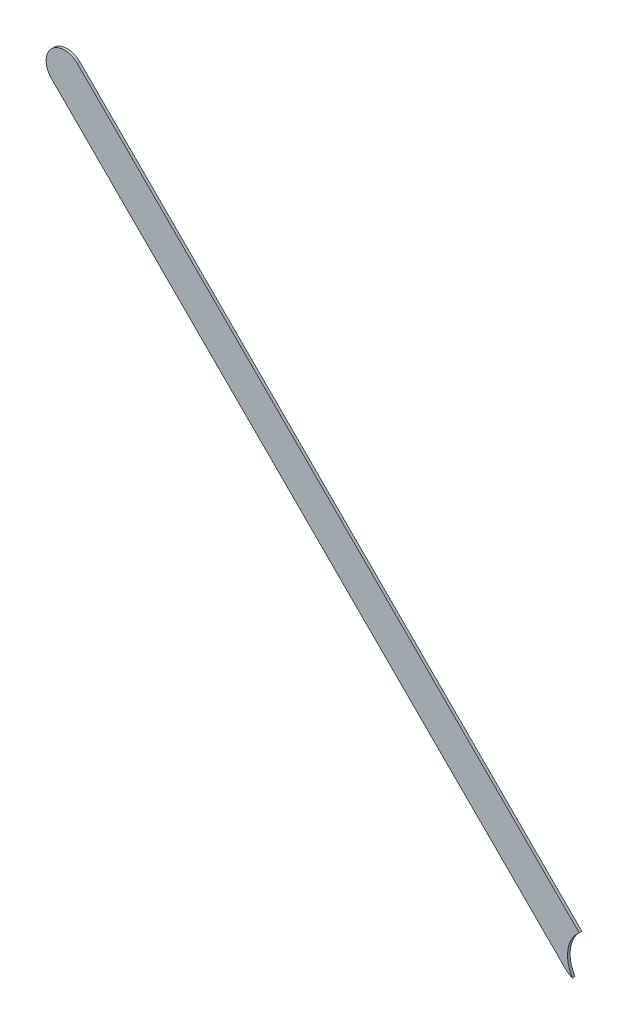
ISO-10303-21;
HEADER;
FILE_DESCRIPTION(('STEP AP214'),'2;1');
FILE_NAME('part.step','',(''),(''),'','','');
FILE_SCHEMA(('AUTOMOTIVE_DESIGN { 1 0 10303 214 1 1 1 1 }'));
ENDSEC;
DATA;
#1=APPLICATION_CONTEXT('core data for automotive mechanical design processes');
#2=APPLICATION_PROTOCOL_DEFINITION('international standard','automotive_design',2000,#1);
#3=PRODUCT_CONTEXT('',#1,'mechanical');
#4=PRODUCT('Part','Part','',(#3));
#5=PRODUCT_RELATED_PRODUCT_CATEGORY('part','',(#4));
#6=PRODUCT_DEFINITION_FORMATION('','',#4);
#7=PRODUCT_DEFINITION_CONTEXT('part definition',#1,'design');
#8=PRODUCT_DEFINITION('design','',#6,#7);
#9=PRODUCT_DEFINITION_SHAPE('','',#8);
#10=(LENGTH_UNIT() NAMED_UNIT(*) SI_UNIT(.MILLI.,.METRE.));
#11=(NAMED_UNIT(*) PLANE_ANGLE_UNIT() SI_UNIT($,.RADIAN.));
#12=(NAMED_UNIT(*) SI_UNIT($,.STERADIAN.) SOLID_ANGLE_UNIT());
#13=UNCERTAINTY_MEASURE_WITH_UNIT(LENGTH_MEASURE(1.E-05),#10,'distance_accuracy_value','');
#14=(GEOMETRIC_REPRESENTATION_CONTEXT(3) GLOBAL_UNCERTAINTY_ASSIGNED_CONTEXT((#13)) GLOBAL_UNIT_ASSIGNED_CONTEXT((#10,
#11,#12)) REPRESENTATION_CONTEXT('',''));
#15=CARTESIAN_POINT('',(0.,0.,0.));
#16=DIRECTION('',(0.,0.,1.));
#17=DIRECTION('',(1.,0.,0.));
#18=AXIS2_PLACEMENT_3D('',#15,#16,#17);
#19=CARTESIAN_POINT('',(109.7232248,61.82322408,0.));
#20=DIRECTION('',(0.707106781186547,0.707106781186548,0.));
#21=DIRECTION('',(0.707106781186548,-0.707106781186547,0.));
#22=AXIS2_PLACEMENT_3D('',#19,#20,#21);
#23=PLANE('',#22);
#24=DIRECTION('',(0.707106781186548,-0.707106781186547,0.));
#25=VECTOR('',#24,1.);
#26=CARTESIAN_POINT('',(109.7232248,61.82322408,0.03556));
#27=LINE('',#26,#25);
#28=CARTESIAN_POINT('',(109.7232248,61.82322408,0.03556));
#29=VERTEX_POINT('',#28);
#30=CARTESIAN_POINT('',(116.72323366,54.82321522,0.03556));
#31=VERTEX_POINT('',#30);
#32=EDGE_CURVE('E11',#29,#31,#27,.T.);
#33=ORIENTED_EDGE('',*,*,#32,.F.);
#34=DIRECTION('',(0.,0.,1.));
#35=VECTOR('',#34,1.);
#36=CARTESIAN_POINT('',(109.7232248,61.82322408,0.));
#37=LINE('',#36,#35);
#38=CARTESIAN_POINT('',(109.7232248,61.82322408,0.));
#39=VERTEX_POINT('',#38);
#40=EDGE_CURVE('E24',#39,#29,#37,.T.);
#41=ORIENTED_EDGE('',*,*,#40,.F.);
#42=DIRECTION('',(0.707106781186548,-0.707106781186547,0.));
#43=VECTOR('',#42,1.);
#44=CARTESIAN_POINT('',(109.7232248,61.82322408,0.));
#45=LINE('',#44,#43);
#46=CARTESIAN_POINT('',(116.72323366,54.82321522,0.));
#47=VERTEX_POINT('',#46);
#48=EDGE_CURVE('E82',#39,#47,#45,.T.);
#49=ORIENTED_EDGE('',*,*,#48,.T.);
#50=DIRECTION('',(0.,0.,1.));
#51=VECTOR('',#50,1.);
#52=CARTESIAN_POINT('',(116.72323366,54.82321522,0.));
#53=LINE('',#52,#51);
#54=EDGE_CURVE('E37',#47,#31,#53,.T.);
#55=ORIENTED_EDGE('',*,*,#54,.T.);
#56=EDGE_LOOP('',(#33,#41,#49,#55));
#57=FACE_BOUND('',#56,.T.);
#58=ADVANCED_FACE('F17',(#57),#23,.F.);
#59=CARTESIAN_POINT('',(116.90001004,54.9999916,0.));
#60=DIRECTION('',(0.,0.,-1.));
#61=DIRECTION('',(-0.707106781186533,-0.707106781186562,0.));
#62=AXIS2_PLACEMENT_3D('',#59,#60,#61);
#63=CYLINDRICAL_SURFACE('',#62,0.249999554103213);
#64=CARTESIAN_POINT('',(116.90001004,54.9999916,0.03556));
#65=DIRECTION('',(0.,0.,1.));
#66=DIRECTION('',(-0.707106781186533,-0.707106781186562,0.));
#67=AXIS2_PLACEMENT_3D('',#64,#65,#66);
#68=CIRCLE('',#67,0.249999554103213);
#69=CARTESIAN_POINT('',(116.816689900372,54.7642851482761,0.03556));
#70=VERTEX_POINT('',#69);
#71=EDGE_CURVE('E98',#31,#70,#68,.T.);
#72=ORIENTED_EDGE('',*,*,#71,.F.);
#73=ORIENTED_EDGE('',*,*,#54,.F.);
#74=CARTESIAN_POINT('',(116.90001004,54.9999916,0.));
#75=DIRECTION('',(0.,0.,1.));
#76=DIRECTION('',(-0.707106781186533,-0.707106781186562,0.));
#77=AXIS2_PLACEMENT_3D('',#74,#75,#76);
#78=CIRCLE('',#77,0.249999554103213);
#79=CARTESIAN_POINT('',(116.816689900372,54.7642851482761,0.));
#80=VERTEX_POINT('',#79);
#81=EDGE_CURVE('E95',#47,#80,#78,.T.);
#82=ORIENTED_EDGE('',*,*,#81,.T.);
#83=DIRECTION('',(0.,0.,1.));
#84=VECTOR('',#83,1.);
#85=CARTESIAN_POINT('',(116.816689900372,54.7642851482761,0.));
#86=LINE('',#85,#84);
#87=EDGE_CURVE('E93',#80,#70,#86,.T.);
#88=ORIENTED_EDGE('',*,*,#87,.T.);
#89=EDGE_LOOP('',(#72,#73,#82,#88));
#90=FACE_BOUND('',#89,.T.);
#91=ADVANCED_FACE('F104',(#90),#63,.T.);
#92=CARTESIAN_POINT('',(117.2000196,54.9999916,0.));
#93=DIRECTION('',(0.,0.,-1.));
#94=DIRECTION('',(1.,0.,0.));
#95=AXIS2_PLACEMENT_3D('',#92,#93,#94);
#96=CYLINDRICAL_SURFACE('',#95,0.4499991);
#97=DIRECTION('',(0.,0.,1.));
#98=VECTOR('',#97,1.);
#99=CARTESIAN_POINT('',(116.909722001821,55.3438323981789,0.));
#100=LINE('',#99,#98);
#101=CARTESIAN_POINT('',(116.909722001821,55.3438323981789,0.));
#102=VERTEX_POINT('',#101);
#103=CARTESIAN_POINT('',(116.909722001821,55.3438323981789,0.03556));
#104=VERTEX_POINT('',#103);
#105=EDGE_CURVE('E73',#102,#104,#100,.T.);
#106=ORIENTED_EDGE('',*,*,#105,.T.);
#107=CARTESIAN_POINT('',(117.2000196,54.9999916,0.03556));
#108=DIRECTION('',(0.,0.,1.));
#109=DIRECTION('',(1.,0.,0.));
#110=AXIS2_PLACEMENT_3D('',#107,#108,#109);
#111=CIRCLE('',#110,0.4499991);
#112=EDGE_CURVE('E89',#104,#70,#111,.T.);
#113=ORIENTED_EDGE('',*,*,#112,.T.);
#114=ORIENTED_EDGE('',*,*,#87,.F.);
#115=CARTESIAN_POINT('',(117.2000196,54.9999916,0.));
#116=DIRECTION('',(0.,0.,1.));
#117=DIRECTION('',(1.,0.,0.));
#118=AXIS2_PLACEMENT_3D('',#115,#116,#117);
#119=CIRCLE('',#118,0.4499991);
#120=EDGE_CURVE('E87',#102,#80,#119,.T.);
#121=ORIENTED_EDGE('',*,*,#120,.F.);
#122=EDGE_LOOP('',(#106,#113,#114,#121));
#123=FACE_BOUND('',#122,.T.);
#124=ADVANCED_FACE('F109',(#123),#96,.F.);
#125=CARTESIAN_POINT('',(116.909722001821,55.343832398179,0.));
#126=DIRECTION('',(-0.707106781186549,-0.707106781186546,0.));
#127=DIRECTION('',(-0.707106781186546,0.707106781186549,0.));
#128=AXIS2_PLACEMENT_3D('',#125,#126,#127);
#129=PLANE('',#128);
#130=DIRECTION('',(-0.707106781186546,0.707106781186549,0.));
#131=VECTOR('',#130,1.);
#132=CARTESIAN_POINT('',(117.07678642,55.17676798,0.03556));
#133=LINE('',#132,#131);
#134=CARTESIAN_POINT('',(110.07677756,62.17677684,0.03556));
#135=VERTEX_POINT('',#134);
#136=EDGE_CURVE('E77',#104,#135,#133,.T.);
#137=ORIENTED_EDGE('',*,*,#136,.F.);
#138=ORIENTED_EDGE('',*,*,#105,.F.);
#139=DIRECTION('',(-0.707106781186546,0.707106781186549,0.));
#140=VECTOR('',#139,1.);
#141=CARTESIAN_POINT('',(117.07678642,55.17676798,0.));
#142=LINE('',#141,#140);
#143=CARTESIAN_POINT('',(110.07677756,62.17677684,0.));
#144=VERTEX_POINT('',#143);
#145=EDGE_CURVE('E69',#102,#144,#142,.T.);
#146=ORIENTED_EDGE('',*,*,#145,.T.);
#147=DIRECTION('',(0.,0.,1.));
#148=VECTOR('',#147,1.);
#149=CARTESIAN_POINT('',(110.07677756,62.17677684,0.));
#150=LINE('',#149,#148);
#151=EDGE_CURVE('E59',#144,#135,#150,.T.);
#152=ORIENTED_EDGE('',*,*,#151,.T.);
#153=EDGE_LOOP('',(#137,#138,#146,#152));
#154=FACE_BOUND('',#153,.T.);
#155=ADVANCED_FACE('F72',(#154),#129,.F.);
#156=CARTESIAN_POINT('',(109.90000118,62.00000046,0.));
#157=DIRECTION('',(0.,0.,-1.));
#158=DIRECTION('',(0.707106781186562,0.707106781186533,0.));
#159=AXIS2_PLACEMENT_3D('',#156,#157,#158);
#160=CYLINDRICAL_SURFACE('',#159,0.249999554103223);
#161=CARTESIAN_POINT('',(109.90000118,62.00000046,0.03556));
#162=DIRECTION('',(0.,0.,1.));
#163=DIRECTION('',(0.707106781186562,0.707106781186533,0.));
#164=AXIS2_PLACEMENT_3D('',#161,#162,#163);
#165=CIRCLE('',#164,0.249999554103223);
#166=EDGE_CURVE('E65',#135,#29,#165,.T.);
#167=ORIENTED_EDGE('',*,*,#166,.F.);
#168=ORIENTED_EDGE('',*,*,#151,.F.);
#169=CARTESIAN_POINT('',(109.90000118,62.00000046,0.));
#170=DIRECTION('',(0.,0.,1.));
#171=DIRECTION('',(0.707106781186562,0.707106781186533,0.));
#172=AXIS2_PLACEMENT_3D('',#169,#170,#171);
#173=CIRCLE('',#172,0.249999554103223);
#174=EDGE_CURVE('E63',#144,#39,#173,.T.);
#175=ORIENTED_EDGE('',*,*,#174,.T.);
#176=ORIENTED_EDGE('',*,*,#40,.T.);
#177=EDGE_LOOP('',(#167,#168,#175,#176));
#178=FACE_BOUND('',#177,.T.);
#179=ADVANCED_FACE('F61',(#178),#160,.T.);
#180=CARTESIAN_POINT('',(109.7232248,61.82322408,0.));
#181=DIRECTION('',(0.,0.,-1.));
#182=DIRECTION('',(-1.,0.,0.));
#183=AXIS2_PLACEMENT_3D('',#180,#181,#182);
#184=PLANE('',#183);
#185=ORIENTED_EDGE('',*,*,#48,.F.);
#186=ORIENTED_EDGE('',*,*,#174,.F.);
#187=ORIENTED_EDGE('',*,*,#145,.F.);
#188=ORIENTED_EDGE('',*,*,#120,.T.);
#189=ORIENTED_EDGE('',*,*,#81,.F.);
#190=EDGE_LOOP('',(#185,#186,#187,#188,#189));
#191=FACE_BOUND('',#190,.T.);
#192=ADVANCED_FACE('F80',(#191),#184,.T.);
#193=CARTESIAN_POINT('',(109.7232248,61.82322408,0.03556));
#194=DIRECTION('',(0.,0.,-1.));
#195=DIRECTION('',(-1.,0.,0.));
#196=AXIS2_PLACEMENT_3D('',#193,#194,#195);
#197=PLANE('',#196);
#198=ORIENTED_EDGE('',*,*,#166,.T.);
#199=ORIENTED_EDGE('',*,*,#32,.T.);
#200=ORIENTED_EDGE('',*,*,#71,.T.);
#201=ORIENTED_EDGE('',*,*,#112,.F.);
#202=ORIENTED_EDGE('',*,*,#136,.T.);
#203=EDGE_LOOP('',(#198,#199,#200,#201,#202));
#204=FACE_BOUND('',#203,.T.);
#205=ADVANCED_FACE('F107',(#204),#197,.F.);
#206=CLOSED_SHELL('',(#58,#91,#124,#155,#179,#192,#205));
#207=MANIFOLD_SOLID_BREP('B1',#206);
#208=ADVANCED_BREP_SHAPE_REPRESENTATION('',(#18,#207),#14);
#209=SHAPE_DEFINITION_REPRESENTATION(#9,#208);
ENDSEC;
END-ISO-10303-21;
